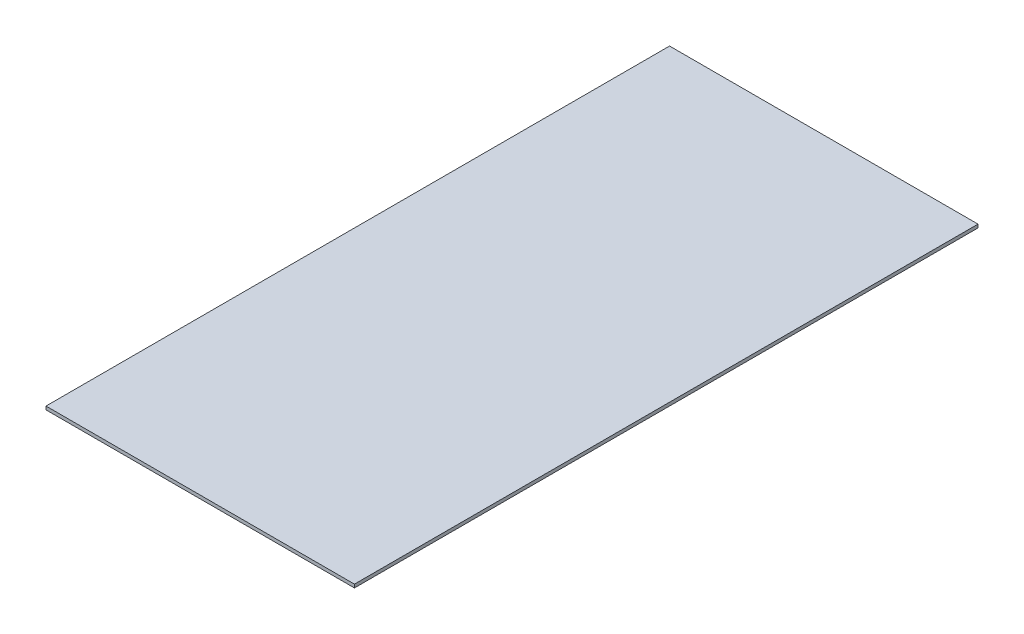
ISO-10303-21;
HEADER;
FILE_DESCRIPTION(('STEP AP214'),'2;1');
FILE_NAME('part.step','',(''),(''),'','','');
FILE_SCHEMA(('AUTOMOTIVE_DESIGN { 1 0 10303 214 1 1 1 1 }'));
ENDSEC;
DATA;
#1=APPLICATION_CONTEXT('core data for automotive mechanical design processes');
#2=APPLICATION_PROTOCOL_DEFINITION('international standard','automotive_design',2000,#1);
#3=PRODUCT_CONTEXT('',#1,'mechanical');
#4=PRODUCT('Part','Part','',(#3));
#5=PRODUCT_RELATED_PRODUCT_CATEGORY('part','',(#4));
#6=PRODUCT_DEFINITION_FORMATION('','',#4);
#7=PRODUCT_DEFINITION_CONTEXT('part definition',#1,'design');
#8=PRODUCT_DEFINITION('design','',#6,#7);
#9=PRODUCT_DEFINITION_SHAPE('','',#8);
#10=(LENGTH_UNIT() NAMED_UNIT(*) SI_UNIT(.MILLI.,.METRE.));
#11=(NAMED_UNIT(*) PLANE_ANGLE_UNIT() SI_UNIT($,.RADIAN.));
#12=(NAMED_UNIT(*) SI_UNIT($,.STERADIAN.) SOLID_ANGLE_UNIT());
#13=UNCERTAINTY_MEASURE_WITH_UNIT(LENGTH_MEASURE(1.E-05),#10,'distance_accuracy_value','');
#14=(GEOMETRIC_REPRESENTATION_CONTEXT(3) GLOBAL_UNCERTAINTY_ASSIGNED_CONTEXT((#13)) GLOBAL_UNIT_ASSIGNED_CONTEXT((#10,
#11,#12)) REPRESENTATION_CONTEXT('',''));
#15=CARTESIAN_POINT('',(0.,0.,0.));
#16=DIRECTION('',(0.,0.,1.));
#17=DIRECTION('',(1.,0.,0.));
#18=AXIS2_PLACEMENT_3D('',#15,#16,#17);
#19=CARTESIAN_POINT('',(0.,3.,0.));
#20=DIRECTION('',(1.,0.,0.));
#21=DIRECTION('',(0.,0.,-1.));
#22=AXIS2_PLACEMENT_3D('',#19,#20,#21);
#23=PLANE('',#22);
#24=DIRECTION('',(0.,0.,1.));
#25=VECTOR('',#24,1.);
#26=CARTESIAN_POINT('',(0.,0.,0.));
#27=LINE('',#26,#25);
#28=CARTESIAN_POINT('',(0.,0.,-560.));
#29=VERTEX_POINT('',#28);
#30=CARTESIAN_POINT('',(0.,0.,0.));
#31=VERTEX_POINT('',#30);
#32=EDGE_CURVE('E95',#29,#31,#27,.T.);
#33=ORIENTED_EDGE('',*,*,#32,.T.);
#34=DIRECTION('',(0.,-1.,0.));
#35=VECTOR('',#34,1.);
#36=CARTESIAN_POINT('',(0.,3.,0.));
#37=LINE('',#36,#35);
#38=CARTESIAN_POINT('',(0.,3.,0.));
#39=VERTEX_POINT('',#38);
#40=EDGE_CURVE('E11',#39,#31,#37,.T.);
#41=ORIENTED_EDGE('',*,*,#40,.F.);
#42=DIRECTION('',(0.,0.,1.));
#43=VECTOR('',#42,1.);
#44=CARTESIAN_POINT('',(0.,3.,0.));
#45=LINE('',#44,#43);
#46=CARTESIAN_POINT('',(0.,3.,-560.));
#47=VERTEX_POINT('',#46);
#48=EDGE_CURVE('E83',#47,#39,#45,.T.);
#49=ORIENTED_EDGE('',*,*,#48,.F.);
#50=DIRECTION('',(0.,-1.,0.));
#51=VECTOR('',#50,1.);
#52=CARTESIAN_POINT('',(0.,3.,-560.));
#53=LINE('',#52,#51);
#54=EDGE_CURVE('E91',#47,#29,#53,.T.);
#55=ORIENTED_EDGE('',*,*,#54,.T.);
#56=EDGE_LOOP('',(#33,#41,#49,#55));
#57=FACE_BOUND('',#56,.T.);
#58=ADVANCED_FACE('F32',(#57),#23,.F.);
#59=CARTESIAN_POINT('',(0.,3.,0.));
#60=DIRECTION('',(0.,0.,-1.));
#61=DIRECTION('',(-1.,0.,0.));
#62=AXIS2_PLACEMENT_3D('',#59,#60,#61);
#63=PLANE('',#62);
#64=DIRECTION('',(1.,0.,0.));
#65=VECTOR('',#64,1.);
#66=CARTESIAN_POINT('',(0.,0.,0.));
#67=LINE('',#66,#65);
#68=CARTESIAN_POINT('',(277.,0.,0.));
#69=VERTEX_POINT('',#68);
#70=EDGE_CURVE('E87',#31,#69,#67,.T.);
#71=ORIENTED_EDGE('',*,*,#70,.T.);
#72=DIRECTION('',(0.,-1.,0.));
#73=VECTOR('',#72,1.);
#74=CARTESIAN_POINT('',(277.,3.,0.));
#75=LINE('',#74,#73);
#76=CARTESIAN_POINT('',(277.,3.,0.));
#77=VERTEX_POINT('',#76);
#78=EDGE_CURVE('E40',#77,#69,#75,.T.);
#79=ORIENTED_EDGE('',*,*,#78,.F.);
#80=DIRECTION('',(1.,0.,0.));
#81=VECTOR('',#80,1.);
#82=CARTESIAN_POINT('',(0.,3.,0.));
#83=LINE('',#82,#81);
#84=EDGE_CURVE('E78',#39,#77,#83,.T.);
#85=ORIENTED_EDGE('',*,*,#84,.F.);
#86=ORIENTED_EDGE('',*,*,#40,.T.);
#87=EDGE_LOOP('',(#71,#79,#85,#86));
#88=FACE_BOUND('',#87,.T.);
#89=ADVANCED_FACE('F86',(#88),#63,.F.);
#90=CARTESIAN_POINT('',(277.,3.,0.));
#91=DIRECTION('',(-1.,0.,0.));
#92=DIRECTION('',(0.,0.,1.));
#93=AXIS2_PLACEMENT_3D('',#90,#91,#92);
#94=PLANE('',#93);
#95=DIRECTION('',(0.,0.,-1.));
#96=VECTOR('',#95,1.);
#97=CARTESIAN_POINT('',(277.,0.,0.));
#98=LINE('',#97,#96);
#99=CARTESIAN_POINT('',(277.,0.,-560.));
#100=VERTEX_POINT('',#99);
#101=EDGE_CURVE('E65',#69,#100,#98,.T.);
#102=ORIENTED_EDGE('',*,*,#101,.T.);
#103=DIRECTION('',(0.,-1.,0.));
#104=VECTOR('',#103,1.);
#105=CARTESIAN_POINT('',(277.,3.,-560.));
#106=LINE('',#105,#104);
#107=CARTESIAN_POINT('',(277.,3.,-560.));
#108=VERTEX_POINT('',#107);
#109=EDGE_CURVE('E88',#108,#100,#106,.T.);
#110=ORIENTED_EDGE('',*,*,#109,.F.);
#111=DIRECTION('',(0.,0.,-1.));
#112=VECTOR('',#111,1.);
#113=CARTESIAN_POINT('',(277.,3.,0.));
#114=LINE('',#113,#112);
#115=EDGE_CURVE('E81',#77,#108,#114,.T.);
#116=ORIENTED_EDGE('',*,*,#115,.F.);
#117=ORIENTED_EDGE('',*,*,#78,.T.);
#118=EDGE_LOOP('',(#102,#110,#116,#117));
#119=FACE_BOUND('',#118,.T.);
#120=ADVANCED_FACE('F89',(#119),#94,.F.);
#121=CARTESIAN_POINT('',(0.,3.,-560.));
#122=DIRECTION('',(0.,0.,1.));
#123=DIRECTION('',(1.,0.,0.));
#124=AXIS2_PLACEMENT_3D('',#121,#122,#123);
#125=PLANE('',#124);
#126=DIRECTION('',(-1.,0.,0.));
#127=VECTOR('',#126,1.);
#128=CARTESIAN_POINT('',(0.,0.,-560.));
#129=LINE('',#128,#127);
#130=EDGE_CURVE('E71',#100,#29,#129,.T.);
#131=ORIENTED_EDGE('',*,*,#130,.T.);
#132=ORIENTED_EDGE('',*,*,#54,.F.);
#133=DIRECTION('',(-1.,0.,0.));
#134=VECTOR('',#133,1.);
#135=CARTESIAN_POINT('',(0.,3.,-560.));
#136=LINE('',#135,#134);
#137=EDGE_CURVE('E48',#108,#47,#136,.T.);
#138=ORIENTED_EDGE('',*,*,#137,.F.);
#139=ORIENTED_EDGE('',*,*,#109,.T.);
#140=EDGE_LOOP('',(#131,#132,#138,#139));
#141=FACE_BOUND('',#140,.T.);
#142=ADVANCED_FACE('F102',(#141),#125,.F.);
#143=CARTESIAN_POINT('',(0.,3.,0.));
#144=DIRECTION('',(0.,-1.,0.));
#145=DIRECTION('',(0.,0.,-1.));
#146=AXIS2_PLACEMENT_3D('',#143,#144,#145);
#147=PLANE('',#146);
#148=ORIENTED_EDGE('',*,*,#48,.T.);
#149=ORIENTED_EDGE('',*,*,#84,.T.);
#150=ORIENTED_EDGE('',*,*,#115,.T.);
#151=ORIENTED_EDGE('',*,*,#137,.T.);
#152=EDGE_LOOP('',(#148,#149,#150,#151));
#153=FACE_BOUND('',#152,.T.);
#154=ADVANCED_FACE('F79',(#153),#147,.F.);
#155=CARTESIAN_POINT('',(0.,0.,0.));
#156=DIRECTION('',(0.,-1.,0.));
#157=DIRECTION('',(0.,0.,-1.));
#158=AXIS2_PLACEMENT_3D('',#155,#156,#157);
#159=PLANE('',#158);
#160=ORIENTED_EDGE('',*,*,#32,.F.);
#161=ORIENTED_EDGE('',*,*,#130,.F.);
#162=ORIENTED_EDGE('',*,*,#101,.F.);
#163=ORIENTED_EDGE('',*,*,#70,.F.);
#164=EDGE_LOOP('',(#160,#161,#162,#163));
#165=FACE_BOUND('',#164,.T.);
#166=ADVANCED_FACE('F105',(#165),#159,.T.);
#167=CLOSED_SHELL('',(#58,#89,#120,#142,#154,#166));
#168=MANIFOLD_SOLID_BREP('B2',#167);
#169=ADVANCED_BREP_SHAPE_REPRESENTATION('',(#18,#168),#14);
#170=SHAPE_DEFINITION_REPRESENTATION(#9,#169);
ENDSEC;
END-ISO-10303-21;
